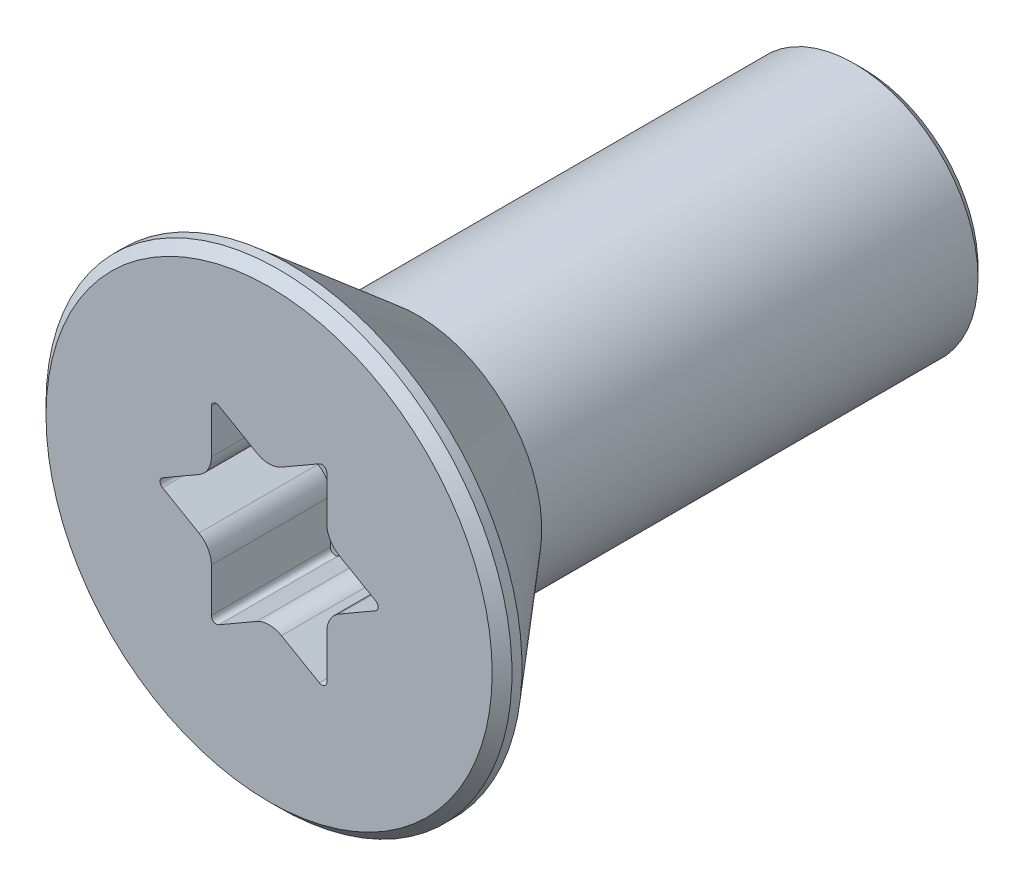
ISO-10303-21;
HEADER;
FILE_DESCRIPTION(('STEP AP214'),'2;1');
FILE_NAME('part.step','',(''),(''),'','','');
FILE_SCHEMA(('AUTOMOTIVE_DESIGN { 1 0 10303 214 1 1 1 1 }'));
ENDSEC;
DATA;
#1=APPLICATION_CONTEXT('core data for automotive mechanical design processes');
#2=APPLICATION_PROTOCOL_DEFINITION('international standard','automotive_design',2000,#1);
#3=PRODUCT_CONTEXT('',#1,'mechanical');
#4=PRODUCT('Part','Part','',(#3));
#5=PRODUCT_RELATED_PRODUCT_CATEGORY('part','',(#4));
#6=PRODUCT_DEFINITION_FORMATION('','',#4);
#7=PRODUCT_DEFINITION_CONTEXT('part definition',#1,'design');
#8=PRODUCT_DEFINITION('design','',#6,#7);
#9=PRODUCT_DEFINITION_SHAPE('','',#8);
#10=(LENGTH_UNIT() NAMED_UNIT(*) SI_UNIT(.MILLI.,.METRE.));
#11=(NAMED_UNIT(*) PLANE_ANGLE_UNIT() SI_UNIT($,.RADIAN.));
#12=(NAMED_UNIT(*) SI_UNIT($,.STERADIAN.) SOLID_ANGLE_UNIT());
#13=UNCERTAINTY_MEASURE_WITH_UNIT(LENGTH_MEASURE(1.E-05),#10,'distance_accuracy_value','');
#14=(GEOMETRIC_REPRESENTATION_CONTEXT(3) GLOBAL_UNCERTAINTY_ASSIGNED_CONTEXT((#13)) GLOBAL_UNIT_ASSIGNED_CONTEXT((#10,
#11,#12)) REPRESENTATION_CONTEXT('',''));
#15=CARTESIAN_POINT('',(0.,0.,0.));
#16=DIRECTION('',(0.,0.,1.));
#17=DIRECTION('',(1.,0.,0.));
#18=AXIS2_PLACEMENT_3D('',#15,#16,#17);
#19=CARTESIAN_POINT('',(95.7999999999978,-74.700000000006,105.35000000001));
#20=DIRECTION('',(0.,0.,1.));
#21=DIRECTION('',(1.,0.,0.));
#22=AXIS2_PLACEMENT_3D('',#19,#20,#21);
#23=PLANE('',#22);
#24=CARTESIAN_POINT('',(95.7999999999978,-75.6526279441494,105.35000000001));
#25=DIRECTION('',(0.,0.,1.));
#26=DIRECTION('',(1.,0.,0.));
#27=AXIS2_PLACEMENT_3D('',#24,#25,#26);
#28=CIRCLE('',#27,0.249999999999991);
#29=CARTESIAN_POINT('',(95.9250000000039,-75.4361215932114,105.35000000001));
#30=VERTEX_POINT('',#29);
#31=CARTESIAN_POINT('',(95.6750000000031,-75.4361215932093,105.35000000001));
#32=VERTEX_POINT('',#31);
#33=EDGE_CURVE('E345',#30,#32,#28,.T.);
#34=ORIENTED_EDGE('',*,*,#33,.F.);
#35=DIRECTION('',(-0.866025403780578,0.500000000006687,0.));
#36=VECTOR('',#35,1.);
#37=CARTESIAN_POINT('',(96.1160254037852,-75.546410161513,105.35000000001));
#38=LINE('',#37,#36);
#39=CARTESIAN_POINT('',(96.3070508075659,-75.6566987298098,105.35000000001));
#40=VERTEX_POINT('',#39);
#41=EDGE_CURVE('E252',#40,#30,#38,.T.);
#42=ORIENTED_EDGE('',*,*,#41,.F.);
#43=CARTESIAN_POINT('',(96.332050807573,-75.6133974596184,105.35000000001));
#44=DIRECTION('',(0.,0.,1.));
#45=DIRECTION('',(1.,0.,0.));
#46=AXIS2_PLACEMENT_3D('',#43,#44,#45);
#47=CIRCLE('',#46,0.0500000000000032);
#48=CARTESIAN_POINT('',(96.3820508075729,-75.6133974596184,105.35000000001));
#49=VERTEX_POINT('',#48);
#50=EDGE_CURVE('E347',#40,#49,#47,.T.);
#51=ORIENTED_EDGE('',*,*,#50,.T.);
#52=DIRECTION('',(0.,1.,0.));
#53=VECTOR('',#52,1.);
#54=CARTESIAN_POINT('',(96.3820508075728,-75.392820323024,105.35000000001));
#55=LINE('',#54,#53);
#56=CARTESIAN_POINT('',(96.3820508075728,-75.1722431864296,105.35000000001));
#57=VERTEX_POINT('',#56);
#58=EDGE_CURVE('E257',#49,#57,#55,.T.);
#59=ORIENTED_EDGE('',*,*,#58,.T.);
#60=CARTESIAN_POINT('',(96.6320508075718,-75.1722431864296,105.35000000001));
#61=DIRECTION('',(0.,0.,1.));
#62=DIRECTION('',(1.,0.,0.));
#63=AXIS2_PLACEMENT_3D('',#60,#61,#62);
#64=CIRCLE('',#63,0.249999999999991);
#65=CARTESIAN_POINT('',(96.5070508075622,-74.9557368354843,105.35000000001));
#66=VERTEX_POINT('',#65);
#67=EDGE_CURVE('E199',#66,#57,#64,.T.);
#68=ORIENTED_EDGE('',*,*,#67,.F.);
#69=DIRECTION('',(-0.866025403783245,-0.500000000002068,0.));
#70=VECTOR('',#69,1.);
#71=CARTESIAN_POINT('',(96.6910254037702,-74.8495190528342,105.35000000001));
#72=LINE('',#71,#70);
#73=CARTESIAN_POINT('',(96.8749999999912,-74.7433012701814,105.35000000001));
#74=VERTEX_POINT('',#73);
#75=EDGE_CURVE('E197',#74,#66,#72,.T.);
#76=ORIENTED_EDGE('',*,*,#75,.F.);
#77=CARTESIAN_POINT('',(96.8499999999936,-74.700000000006,105.35000000001));
#78=DIRECTION('',(0.,0.,1.));
#79=DIRECTION('',(1.,0.,0.));
#80=AXIS2_PLACEMENT_3D('',#77,#78,#79);
#81=CIRCLE('',#80,0.0500000000000032);
#82=CARTESIAN_POINT('',(96.8750000000022,-74.6566987298116,105.35000000001));
#83=VERTEX_POINT('',#82);
#84=EDGE_CURVE('E20',#74,#83,#81,.T.);
#85=ORIENTED_EDGE('',*,*,#84,.T.);
#86=DIRECTION('',(-0.86602540378322,0.500000000002111,0.));
#87=VECTOR('',#86,1.);
#88=CARTESIAN_POINT('',(96.6910254037702,-74.5504809471524,105.35000000001));
#89=LINE('',#88,#87);
#90=CARTESIAN_POINT('',(96.5070508075711,-74.4442631645122,105.35000000001));
#91=VERTEX_POINT('',#90);
#92=EDGE_CURVE('E212',#83,#91,#89,.T.);
#93=ORIENTED_EDGE('',*,*,#92,.T.);
#94=CARTESIAN_POINT('',(96.6320508075718,-74.2277568135824,105.35000000001));
#95=DIRECTION('',(0.,0.,1.));
#96=DIRECTION('',(1.,0.,0.));
#97=AXIS2_PLACEMENT_3D('',#94,#95,#96);
#98=CIRCLE('',#97,0.249999999999991);
#99=CARTESIAN_POINT('',(96.3820508075723,-74.2277568135824,105.35000000001));
#100=VERTEX_POINT('',#99);
#101=EDGE_CURVE('E327',#100,#91,#98,.T.);
#102=ORIENTED_EDGE('',*,*,#101,.F.);
#103=DIRECTION('',(0.,1.,0.));
#104=VECTOR('',#103,1.);
#105=CARTESIAN_POINT('',(96.3820508075728,-74.0071796769626,105.35000000001));
#106=LINE('',#105,#104);
#107=CARTESIAN_POINT('',(96.3820508075728,-73.7866025403682,105.35000000001));
#108=VERTEX_POINT('',#107);
#109=EDGE_CURVE('E215',#100,#108,#106,.T.);
#110=ORIENTED_EDGE('',*,*,#109,.T.);
#111=CARTESIAN_POINT('',(96.332050807573,-73.7866025403682,105.35000000001));
#112=DIRECTION('',(0.,0.,1.));
#113=DIRECTION('',(1.,0.,0.));
#114=AXIS2_PLACEMENT_3D('',#111,#112,#113);
#115=CIRCLE('',#114,0.0500000000000032);
#116=CARTESIAN_POINT('',(96.3070508075618,-73.7433012701823,105.35000000001));
#117=VERTEX_POINT('',#116);
#118=EDGE_CURVE('E331',#108,#117,#115,.T.);
#119=ORIENTED_EDGE('',*,*,#118,.T.);
#120=DIRECTION('',(-0.866025403780578,-0.500000000006687,0.));
#121=VECTOR('',#120,1.);
#122=CARTESIAN_POINT('',(96.1160254037852,-73.8535898384736,105.35000000001));
#123=LINE('',#122,#121);
#124=CARTESIAN_POINT('',(95.9249999999965,-73.963878406775,105.35000000001));
#125=VERTEX_POINT('',#124);
#126=EDGE_CURVE('E220',#117,#125,#123,.T.);
#127=ORIENTED_EDGE('',*,*,#126,.T.);
#128=CARTESIAN_POINT('',(95.7999999999978,-73.7473720558372,105.35000000001));
#129=DIRECTION('',(0.,0.,1.));
#130=DIRECTION('',(1.,0.,0.));
#131=AXIS2_PLACEMENT_3D('',#128,#129,#130);
#132=CIRCLE('',#131,0.249999999999991);
#133=CARTESIAN_POINT('',(95.6750000000067,-73.9638784067839,105.35000000001));
#134=VERTEX_POINT('',#133);
#135=EDGE_CURVE('E223',#134,#125,#132,.T.);
#136=ORIENTED_EDGE('',*,*,#135,.F.);
#137=DIRECTION('',(-0.866025403780578,0.500000000006687,0.));
#138=VECTOR('',#137,1.);
#139=CARTESIAN_POINT('',(95.4839745962104,-73.8535898384736,105.35000000001));
#140=LINE('',#139,#138);
#141=CARTESIAN_POINT('',(95.2929491924352,-73.7433012701799,105.35000000001));
#142=VERTEX_POINT('',#141);
#143=EDGE_CURVE('E224',#134,#142,#140,.T.);
#144=ORIENTED_EDGE('',*,*,#143,.T.);
#145=CARTESIAN_POINT('',(95.2679491924226,-73.7866025403682,105.35000000001));
#146=DIRECTION('',(0.,0.,1.));
#147=DIRECTION('',(1.,0.,0.));
#148=AXIS2_PLACEMENT_3D('',#145,#146,#147);
#149=CIRCLE('',#148,0.0500000000000032);
#150=CARTESIAN_POINT('',(95.2179491924227,-73.7866025403682,105.35000000001));
#151=VERTEX_POINT('',#150);
#152=EDGE_CURVE('E232',#142,#151,#149,.T.);
#153=ORIENTED_EDGE('',*,*,#152,.T.);
#154=DIRECTION('',(0.,1.,0.));
#155=VECTOR('',#154,1.);
#156=CARTESIAN_POINT('',(95.2179491924228,-74.0071796769626,105.35000000001));
#157=LINE('',#156,#155);
#158=CARTESIAN_POINT('',(95.2179491924228,-74.2277568135824,105.35000000001));
#159=VERTEX_POINT('',#158);
#160=EDGE_CURVE('E229',#159,#151,#157,.T.);
#161=ORIENTED_EDGE('',*,*,#160,.F.);
#162=CARTESIAN_POINT('',(94.9679491924238,-74.2277568135824,105.35000000001));
#163=DIRECTION('',(0.,0.,1.));
#164=DIRECTION('',(1.,0.,0.));
#165=AXIS2_PLACEMENT_3D('',#162,#163,#164);
#166=CIRCLE('',#165,0.249999999999991);
#167=CARTESIAN_POINT('',(95.0929491924279,-74.4442631645182,105.35000000001));
#168=VERTEX_POINT('',#167);
#169=EDGE_CURVE('E337',#168,#159,#166,.T.);
#170=ORIENTED_EDGE('',*,*,#169,.F.);
#171=DIRECTION('',(-0.86602540378322,-0.500000000002111,0.));
#172=VECTOR('',#171,1.);
#173=CARTESIAN_POINT('',(94.9089745962254,-74.5504809471524,105.35000000001));
#174=LINE('',#173,#172);
#175=CARTESIAN_POINT('',(94.7249999999934,-74.6566987298116,105.35000000001));
#176=VERTEX_POINT('',#175);
#177=EDGE_CURVE('E234',#168,#176,#174,.T.);
#178=ORIENTED_EDGE('',*,*,#177,.T.);
#179=CARTESIAN_POINT('',(94.750000000002,-74.700000000006,105.35000000001));
#180=DIRECTION('',(0.,0.,1.));
#181=DIRECTION('',(1.,0.,0.));
#182=AXIS2_PLACEMENT_3D('',#179,#180,#181);
#183=CIRCLE('',#182,0.0500000000000032);
#184=CARTESIAN_POINT('',(94.7250000000011,-74.7433012701871,105.35000000001));
#185=VERTEX_POINT('',#184);
#186=EDGE_CURVE('E241',#176,#185,#183,.T.);
#187=ORIENTED_EDGE('',*,*,#186,.T.);
#188=DIRECTION('',(-0.866025403783288,0.500000000001993,0.));
#189=VECTOR('',#188,1.);
#190=CARTESIAN_POINT('',(94.9089745962254,-74.8495190528342,105.35000000001));
#191=LINE('',#190,#189);
#192=CARTESIAN_POINT('',(95.0929491924355,-74.9557368354807,105.35000000001));
#193=VERTEX_POINT('',#192);
#194=EDGE_CURVE('E238',#193,#185,#191,.T.);
#195=ORIENTED_EDGE('',*,*,#194,.F.);
#196=CARTESIAN_POINT('',(94.9679491924238,-75.1722431864296,105.35000000001));
#197=DIRECTION('',(0.,0.,1.));
#198=DIRECTION('',(1.,0.,0.));
#199=AXIS2_PLACEMENT_3D('',#196,#197,#198);
#200=CIRCLE('',#199,0.249999999999991);
#201=CARTESIAN_POINT('',(95.2179491924233,-75.1722431864296,105.35000000001));
#202=VERTEX_POINT('',#201);
#203=EDGE_CURVE('E341',#202,#193,#200,.T.);
#204=ORIENTED_EDGE('',*,*,#203,.F.);
#205=DIRECTION('',(0.,1.,0.));
#206=VECTOR('',#205,1.);
#207=CARTESIAN_POINT('',(95.2179491924228,-75.392820323024,105.35000000001));
#208=LINE('',#207,#206);
#209=CARTESIAN_POINT('',(95.2179491924228,-75.6133974596184,105.35000000001));
#210=VERTEX_POINT('',#209);
#211=EDGE_CURVE('E243',#210,#202,#208,.T.);
#212=ORIENTED_EDGE('',*,*,#211,.F.);
#213=CARTESIAN_POINT('',(95.2679491924226,-75.6133974596184,105.35000000001));
#214=DIRECTION('',(0.,0.,1.));
#215=DIRECTION('',(1.,0.,0.));
#216=AXIS2_PLACEMENT_3D('',#213,#214,#215);
#217=CIRCLE('',#216,0.0500000000000032);
#218=CARTESIAN_POINT('',(95.2929491924283,-75.6566987298075,105.35000000001));
#219=VERTEX_POINT('',#218);
#220=EDGE_CURVE('E250',#210,#219,#217,.T.);
#221=ORIENTED_EDGE('',*,*,#220,.T.);
#222=DIRECTION('',(-0.866025403780578,-0.500000000006687,0.));
#223=VECTOR('',#222,1.);
#224=CARTESIAN_POINT('',(95.4839745962104,-75.546410161513,105.35000000001));
#225=LINE('',#224,#223);
#226=EDGE_CURVE('E247',#32,#219,#225,.T.);
#227=ORIENTED_EDGE('',*,*,#226,.F.);
#228=EDGE_LOOP('',(#34,#42,#51,#59,#68,#76,#85,#93,#102,#110,#119,#127,#136,#144,#153,#161,#170,
#178,#187,#195,#204,#212,#221,#227));
#229=FACE_BOUND('',#228,.T.);
#230=ADVANCED_FACE('F17',(#229),#23,.T.);
#231=CARTESIAN_POINT('',(96.8499999999936,-74.700000000006,105.326000000004));
#232=DIRECTION('',(0.,0.,1.));
#233=DIRECTION('',(1.,0.,0.));
#234=AXIS2_PLACEMENT_3D('',#231,#232,#233);
#235=CYLINDRICAL_SURFACE('',#234,0.0500000000000032);
#236=ORIENTED_EDGE('',*,*,#84,.F.);
#237=DIRECTION('',(0.,0.,1.));
#238=VECTOR('',#237,1.);
#239=CARTESIAN_POINT('',(96.8749999999953,-74.743301270179,105.950000000008));
#240=LINE('',#239,#238);
#241=CARTESIAN_POINT('',(96.8749999999962,-74.743301270191,106.550000000006));
#242=VERTEX_POINT('',#241);
#243=EDGE_CURVE('E190',#242,#74,#240,.F.);
#244=ORIENTED_EDGE('',*,*,#243,.F.);
#245=CARTESIAN_POINT('',(96.8499999999936,-74.700000000006,106.550000000006));
#246=DIRECTION('',(0.,0.,1.));
#247=DIRECTION('',(1.,0.,0.));
#248=AXIS2_PLACEMENT_3D('',#245,#246,#247);
#249=CIRCLE('',#248,0.0500000000000032);
#250=CARTESIAN_POINT('',(96.8750000000017,-74.6566987298115,106.550000000006));
#251=VERTEX_POINT('',#250);
#252=EDGE_CURVE('E325',#251,#242,#249,.F.);
#253=ORIENTED_EDGE('',*,*,#252,.F.);
#254=DIRECTION('',(0.,0.,1.));
#255=VECTOR('',#254,1.);
#256=CARTESIAN_POINT('',(96.8750000000063,-74.656698729814,105.950000000008));
#257=LINE('',#256,#255);
#258=EDGE_CURVE('E193',#251,#83,#257,.F.);
#259=ORIENTED_EDGE('',*,*,#258,.T.);
#260=EDGE_LOOP('',(#236,#244,#253,#259));
#261=FACE_BOUND('',#260,.T.);
#262=ADVANCED_FACE('F188',(#261),#235,.F.);
#263=CARTESIAN_POINT('',(96.6910254037702,-74.8495190528342,105.950000000008));
#264=DIRECTION('',(-0.500000000002068,0.866025403783245,0.));
#265=DIRECTION('',(-0.866025403783245,-0.500000000002068,0.));
#266=AXIS2_PLACEMENT_3D('',#263,#264,#265);
#267=PLANE('',#266);
#268=DIRECTION('',(0.,0.,1.));
#269=VECTOR('',#268,1.);
#270=CARTESIAN_POINT('',(96.5070508075572,-74.9557368354919,105.326000000004));
#271=LINE('',#270,#269);
#272=CARTESIAN_POINT('',(96.5070508075677,-74.9557368354886,106.550000000006));
#273=VERTEX_POINT('',#272);
#274=EDGE_CURVE('E202',#273,#66,#271,.F.);
#275=ORIENTED_EDGE('',*,*,#274,.F.);
#276=DIRECTION('',(-0.866025403793562,-0.499999999984198,0.));
#277=VECTOR('',#276,1.);
#278=CARTESIAN_POINT('',(96.8750000000062,-74.7433012701978,106.550000000006));
#279=LINE('',#278,#277);
#280=EDGE_CURVE('E206',#242,#273,#279,.T.);
#281=ORIENTED_EDGE('',*,*,#280,.F.);
#282=ORIENTED_EDGE('',*,*,#243,.T.);
#283=ORIENTED_EDGE('',*,*,#75,.T.);
#284=EDGE_LOOP('',(#275,#281,#282,#283));
#285=FACE_BOUND('',#284,.T.);
#286=ADVANCED_FACE('F204',(#285),#267,.T.);
#287=CARTESIAN_POINT('',(96.6320508075718,-75.1722431864296,105.326000000004));
#288=DIRECTION('',(0.,0.,1.));
#289=DIRECTION('',(1.,0.,0.));
#290=AXIS2_PLACEMENT_3D('',#287,#288,#289);
#291=CYLINDRICAL_SURFACE('',#290,0.249999999999991);
#292=DIRECTION('',(0.,0.,-1.));
#293=VECTOR('',#292,1.);
#294=CARTESIAN_POINT('',(96.3820508075728,-75.1722431864296,105.950000000008));
#295=LINE('',#294,#293);
#296=CARTESIAN_POINT('',(96.3820508075728,-75.1722431864296,106.550000000006));
#297=VERTEX_POINT('',#296);
#298=EDGE_CURVE('E258',#57,#297,#295,.F.);
#299=ORIENTED_EDGE('',*,*,#298,.T.);
#300=CARTESIAN_POINT('',(96.6320508075718,-75.1722431864296,106.550000000006));
#301=DIRECTION('',(0.,0.,1.));
#302=DIRECTION('',(1.,0.,0.));
#303=AXIS2_PLACEMENT_3D('',#300,#301,#302);
#304=CIRCLE('',#303,0.249999999999991);
#305=EDGE_CURVE('E322',#273,#297,#304,.T.);
#306=ORIENTED_EDGE('',*,*,#305,.F.);
#307=ORIENTED_EDGE('',*,*,#274,.T.);
#308=ORIENTED_EDGE('',*,*,#67,.T.);
#309=EDGE_LOOP('',(#299,#306,#307,#308));
#310=FACE_BOUND('',#309,.T.);
#311=ADVANCED_FACE('F352',(#310),#291,.T.);
#312=CARTESIAN_POINT('',(96.3820508075728,-75.392820323024,105.950000000008));
#313=DIRECTION('',(1.,0.,0.));
#314=DIRECTION('',(0.,0.,-1.));
#315=AXIS2_PLACEMENT_3D('',#312,#313,#314);
#316=PLANE('',#315);
#317=ORIENTED_EDGE('',*,*,#58,.F.);
#318=DIRECTION('',(0.,0.,1.));
#319=VECTOR('',#318,1.);
#320=CARTESIAN_POINT('',(96.382050807573,-75.6133974596184,105.326000000004));
#321=LINE('',#320,#319);
#322=CARTESIAN_POINT('',(96.3820508075729,-75.6133974596184,106.550000000006));
#323=VERTEX_POINT('',#322);
#324=EDGE_CURVE('E348',#49,#323,#321,.T.);
#325=ORIENTED_EDGE('',*,*,#324,.T.);
#326=DIRECTION('',(0.,1.,0.));
#327=VECTOR('',#326,1.);
#328=CARTESIAN_POINT('',(96.3820508075728,-74.700000000006,106.550000000006));
#329=LINE('',#328,#327);
#330=EDGE_CURVE('E321',#297,#323,#329,.F.);
#331=ORIENTED_EDGE('',*,*,#330,.F.);
#332=ORIENTED_EDGE('',*,*,#298,.F.);
#333=EDGE_LOOP('',(#317,#325,#331,#332));
#334=FACE_BOUND('',#333,.T.);
#335=ADVANCED_FACE('F400',(#334),#316,.F.);
#336=CARTESIAN_POINT('',(96.332050807573,-75.6133974596184,105.326000000004));
#337=DIRECTION('',(0.,0.,1.));
#338=DIRECTION('',(1.,0.,0.));
#339=AXIS2_PLACEMENT_3D('',#336,#337,#338);
#340=CYLINDRICAL_SURFACE('',#339,0.0500000000000032);
#341=ORIENTED_EDGE('',*,*,#50,.F.);
#342=DIRECTION('',(0.,0.,1.));
#343=VECTOR('',#342,1.);
#344=CARTESIAN_POINT('',(96.3070508075619,-75.6566987298075,105.950000000008));
#345=LINE('',#344,#343);
#346=CARTESIAN_POINT('',(96.3070508075649,-75.656698729811,106.550000000006));
#347=VERTEX_POINT('',#346);
#348=EDGE_CURVE('E256',#347,#40,#345,.F.);
#349=ORIENTED_EDGE('',*,*,#348,.F.);
#350=CARTESIAN_POINT('',(96.332050807573,-75.6133974596184,106.550000000006));
#351=DIRECTION('',(0.,0.,1.));
#352=DIRECTION('',(1.,0.,0.));
#353=AXIS2_PLACEMENT_3D('',#350,#351,#352);
#354=CIRCLE('',#353,0.0500000000000032);
#355=EDGE_CURVE('E318',#323,#347,#354,.F.);
#356=ORIENTED_EDGE('',*,*,#355,.F.);
#357=ORIENTED_EDGE('',*,*,#324,.F.);
#358=EDGE_LOOP('',(#341,#349,#356,#357));
#359=FACE_BOUND('',#358,.T.);
#360=ADVANCED_FACE('F404',(#359),#340,.F.);
#361=CARTESIAN_POINT('',(96.1160254037852,-75.546410161513,105.950000000008));
#362=DIRECTION('',(0.500000000006687,0.866025403780578,0.));
#363=DIRECTION('',(-0.866025403780578,0.500000000006687,0.));
#364=AXIS2_PLACEMENT_3D('',#361,#362,#363);
#365=PLANE('',#364);
#366=DIRECTION('',(0.,0.,1.));
#367=VECTOR('',#366,1.);
#368=CARTESIAN_POINT('',(95.9250000000123,-75.4361215932117,105.326000000004));
#369=LINE('',#368,#367);
#370=CARTESIAN_POINT('',(95.9250000000062,-75.4361215932109,106.550000000006));
#371=VERTEX_POINT('',#370);
#372=EDGE_CURVE('E255',#371,#30,#369,.F.);
#373=ORIENTED_EDGE('',*,*,#372,.F.);
#374=DIRECTION('',(-0.866025403773598,0.500000000018777,0.));
#375=VECTOR('',#374,1.);
#376=CARTESIAN_POINT('',(96.3070508075604,-75.6566987298102,106.550000000006));
#377=LINE('',#376,#375);
#378=EDGE_CURVE('E317',#347,#371,#377,.T.);
#379=ORIENTED_EDGE('',*,*,#378,.F.);
#380=ORIENTED_EDGE('',*,*,#348,.T.);
#381=ORIENTED_EDGE('',*,*,#41,.T.);
#382=EDGE_LOOP('',(#373,#379,#380,#381));
#383=FACE_BOUND('',#382,.T.);
#384=ADVANCED_FACE('F408',(#383),#365,.T.);
#385=CARTESIAN_POINT('',(95.7999999999978,-75.6526279441494,105.326000000004));
#386=DIRECTION('',(0.,0.,1.));
#387=DIRECTION('',(1.,0.,0.));
#388=AXIS2_PLACEMENT_3D('',#385,#386,#387);
#389=CYLINDRICAL_SURFACE('',#388,0.249999999999991);
#390=CARTESIAN_POINT('',(95.7999999999978,-75.6526279441494,106.550000000006));
#391=DIRECTION('',(0.,0.,1.));
#392=DIRECTION('',(1.,0.,0.));
#393=AXIS2_PLACEMENT_3D('',#390,#391,#392);
#394=CIRCLE('',#393,0.249999999999991);
#395=CARTESIAN_POINT('',(95.6750000000071,-75.4361215932125,106.550000000006));
#396=VERTEX_POINT('',#395);
#397=EDGE_CURVE('E314',#371,#396,#394,.T.);
#398=ORIENTED_EDGE('',*,*,#397,.F.);
#399=ORIENTED_EDGE('',*,*,#372,.T.);
#400=ORIENTED_EDGE('',*,*,#33,.T.);
#401=DIRECTION('',(0.,0.,1.));
#402=VECTOR('',#401,1.);
#403=CARTESIAN_POINT('',(95.6750000000062,-75.4361215932075,105.950000000008));
#404=LINE('',#403,#402);
#405=EDGE_CURVE('E251',#396,#32,#404,.F.);
#406=ORIENTED_EDGE('',*,*,#405,.F.);
#407=EDGE_LOOP('',(#398,#399,#400,#406));
#408=FACE_BOUND('',#407,.T.);
#409=ADVANCED_FACE('F702',(#408),#389,.T.);
#410=CARTESIAN_POINT('',(95.4839745962104,-75.546410161513,105.950000000008));
#411=DIRECTION('',(-0.500000000006687,0.866025403780578,0.));
#412=DIRECTION('',(-0.866025403780578,-0.500000000006687,0.));
#413=AXIS2_PLACEMENT_3D('',#410,#411,#412);
#414=PLANE('',#413);
#415=DIRECTION('',(0.,0.,1.));
#416=VECTOR('',#415,1.);
#417=CARTESIAN_POINT('',(95.2929491924309,-75.6566987298028,105.326000000004));
#418=LINE('',#417,#416);
#419=CARTESIAN_POINT('',(95.2929491924287,-75.656698729809,106.550000000006));
#420=VERTEX_POINT('',#419);
#421=EDGE_CURVE('E344',#219,#420,#418,.T.);
#422=ORIENTED_EDGE('',*,*,#421,.T.);
#423=DIRECTION('',(-0.86602540378799,-0.49999999999385,0.));
#424=VECTOR('',#423,1.);
#425=CARTESIAN_POINT('',(95.675000000011,-75.4361215932158,106.550000000006));
#426=LINE('',#425,#424);
#427=EDGE_CURVE('E313',#396,#420,#426,.T.);
#428=ORIENTED_EDGE('',*,*,#427,.F.);
#429=ORIENTED_EDGE('',*,*,#405,.T.);
#430=ORIENTED_EDGE('',*,*,#226,.T.);
#431=EDGE_LOOP('',(#422,#428,#429,#430));
#432=FACE_BOUND('',#431,.T.);
#433=ADVANCED_FACE('F692',(#432),#414,.T.);
#434=CARTESIAN_POINT('',(95.2679491924226,-75.6133974596184,105.326000000004));
#435=DIRECTION('',(0.,0.,1.));
#436=DIRECTION('',(1.,0.,0.));
#437=AXIS2_PLACEMENT_3D('',#434,#435,#436);
#438=CYLINDRICAL_SURFACE('',#437,0.0500000000000032);
#439=ORIENTED_EDGE('',*,*,#220,.F.);
#440=DIRECTION('',(0.,0.,-1.));
#441=VECTOR('',#440,1.);
#442=CARTESIAN_POINT('',(95.2179491924228,-75.6133974596184,105.950000000008));
#443=LINE('',#442,#441);
#444=CARTESIAN_POINT('',(95.2179491924228,-75.6133974596184,106.550000000006));
#445=VERTEX_POINT('',#444);
#446=EDGE_CURVE('E246',#445,#210,#443,.T.);
#447=ORIENTED_EDGE('',*,*,#446,.F.);
#448=CARTESIAN_POINT('',(95.2679491924226,-75.6133974596184,106.550000000006));
#449=DIRECTION('',(0.,0.,1.));
#450=DIRECTION('',(1.,0.,0.));
#451=AXIS2_PLACEMENT_3D('',#448,#449,#450);
#452=CIRCLE('',#451,0.0500000000000032);
#453=EDGE_CURVE('E310',#420,#445,#452,.F.);
#454=ORIENTED_EDGE('',*,*,#453,.F.);
#455=ORIENTED_EDGE('',*,*,#421,.F.);
#456=EDGE_LOOP('',(#439,#447,#454,#455));
#457=FACE_BOUND('',#456,.T.);
#458=ADVANCED_FACE('F682',(#457),#438,.F.);
#459=CARTESIAN_POINT('',(95.2179491924228,-75.392820323024,105.950000000008));
#460=DIRECTION('',(1.,0.,0.));
#461=DIRECTION('',(0.,0.,-1.));
#462=AXIS2_PLACEMENT_3D('',#459,#460,#461);
#463=PLANE('',#462);
#464=DIRECTION('',(0.,0.,1.));
#465=VECTOR('',#464,1.);
#466=CARTESIAN_POINT('',(95.2179491924238,-75.1722431864296,105.326000000004));
#467=LINE('',#466,#465);
#468=CARTESIAN_POINT('',(95.2179491924233,-75.1722431864296,106.550000000006));
#469=VERTEX_POINT('',#468);
#470=EDGE_CURVE('E245',#469,#202,#467,.F.);
#471=ORIENTED_EDGE('',*,*,#470,.F.);
#472=DIRECTION('',(0.,1.,0.));
#473=VECTOR('',#472,1.);
#474=CARTESIAN_POINT('',(95.2179491924228,-74.700000000006,106.550000000006));
#475=LINE('',#474,#473);
#476=EDGE_CURVE('E309',#445,#469,#475,.T.);
#477=ORIENTED_EDGE('',*,*,#476,.F.);
#478=ORIENTED_EDGE('',*,*,#446,.T.);
#479=ORIENTED_EDGE('',*,*,#211,.T.);
#480=EDGE_LOOP('',(#471,#477,#478,#479));
#481=FACE_BOUND('',#480,.T.);
#482=ADVANCED_FACE('F672',(#481),#463,.T.);
#483=CARTESIAN_POINT('',(94.9679491924238,-75.1722431864296,105.326000000004));
#484=DIRECTION('',(0.,0.,1.));
#485=DIRECTION('',(1.,0.,0.));
#486=AXIS2_PLACEMENT_3D('',#483,#484,#485);
#487=CYLINDRICAL_SURFACE('',#486,0.249999999999991);
#488=DIRECTION('',(0.,0.,1.));
#489=VECTOR('',#488,1.);
#490=CARTESIAN_POINT('',(95.0929491924425,-74.9557368354848,105.950000000008));
#491=LINE('',#490,#489);
#492=CARTESIAN_POINT('',(95.09294919243,-74.955736835485,106.550000000006));
#493=VERTEX_POINT('',#492);
#494=EDGE_CURVE('E242',#493,#193,#491,.F.);
#495=ORIENTED_EDGE('',*,*,#494,.F.);
#496=CARTESIAN_POINT('',(94.9679491924238,-75.1722431864296,106.550000000006));
#497=DIRECTION('',(0.,0.,1.));
#498=DIRECTION('',(1.,0.,0.));
#499=AXIS2_PLACEMENT_3D('',#496,#497,#498);
#500=CIRCLE('',#499,0.249999999999991);
#501=EDGE_CURVE('E306',#469,#493,#500,.T.);
#502=ORIENTED_EDGE('',*,*,#501,.F.);
#503=ORIENTED_EDGE('',*,*,#470,.T.);
#504=ORIENTED_EDGE('',*,*,#203,.T.);
#505=EDGE_LOOP('',(#495,#502,#503,#504));
#506=FACE_BOUND('',#505,.T.);
#507=ADVANCED_FACE('F662',(#506),#487,.T.);
#508=CARTESIAN_POINT('',(94.9089745962254,-74.8495190528342,105.950000000008));
#509=DIRECTION('',(0.500000000001993,0.866025403783288,0.));
#510=DIRECTION('',(-0.866025403783288,0.500000000001993,0.));
#511=AXIS2_PLACEMENT_3D('',#508,#509,#510);
#512=PLANE('',#511);
#513=DIRECTION('',(0.,0.,1.));
#514=VECTOR('',#513,1.);
#515=CARTESIAN_POINT('',(94.7249999999937,-74.7433012701904,105.326000000004));
#516=LINE('',#515,#514);
#517=CARTESIAN_POINT('',(94.7249999999961,-74.7433012701967,106.550000000006));
#518=VERTEX_POINT('',#517);
#519=EDGE_CURVE('E237',#185,#518,#516,.T.);
#520=ORIENTED_EDGE('',*,*,#519,.T.);
#521=DIRECTION('',(-0.866025403793562,0.499999999984198,0.));
#522=VECTOR('',#521,1.);
#523=CARTESIAN_POINT('',(95.092949192436,-74.955736835496,106.550000000006));
#524=LINE('',#523,#522);
#525=EDGE_CURVE('E305',#493,#518,#524,.T.);
#526=ORIENTED_EDGE('',*,*,#525,.F.);
#527=ORIENTED_EDGE('',*,*,#494,.T.);
#528=ORIENTED_EDGE('',*,*,#194,.T.);
#529=EDGE_LOOP('',(#520,#526,#527,#528));
#530=FACE_BOUND('',#529,.T.);
#531=ADVANCED_FACE('F652',(#530),#512,.T.);
#532=CARTESIAN_POINT('',(94.750000000002,-74.700000000006,105.326000000004));
#533=DIRECTION('',(0.,0.,1.));
#534=DIRECTION('',(1.,0.,0.));
#535=AXIS2_PLACEMENT_3D('',#532,#533,#534);
#536=CYLINDRICAL_SURFACE('',#535,0.0500000000000032);
#537=ORIENTED_EDGE('',*,*,#186,.F.);
#538=DIRECTION('',(0.,0.,1.));
#539=VECTOR('',#538,1.);
#540=CARTESIAN_POINT('',(94.7249999999893,-74.656698729814,105.950000000008));
#541=LINE('',#540,#539);
#542=CARTESIAN_POINT('',(94.7249999999939,-74.6566987298115,106.550000000006));
#543=VERTEX_POINT('',#542);
#544=EDGE_CURVE('E236',#176,#543,#541,.T.);
#545=ORIENTED_EDGE('',*,*,#544,.T.);
#546=CARTESIAN_POINT('',(94.750000000002,-74.700000000006,106.550000000006));
#547=DIRECTION('',(0.,0.,1.));
#548=DIRECTION('',(1.,0.,0.));
#549=AXIS2_PLACEMENT_3D('',#546,#547,#548);
#550=CIRCLE('',#549,0.0500000000000032);
#551=EDGE_CURVE('E302',#518,#543,#550,.F.);
#552=ORIENTED_EDGE('',*,*,#551,.F.);
#553=ORIENTED_EDGE('',*,*,#519,.F.);
#554=EDGE_LOOP('',(#537,#545,#552,#553));
#555=FACE_BOUND('',#554,.T.);
#556=ADVANCED_FACE('F642',(#555),#536,.F.);
#557=CARTESIAN_POINT('',(94.9089745962254,-74.5504809471524,105.950000000008));
#558=DIRECTION('',(-0.500000000002111,0.86602540378322,0.));
#559=DIRECTION('',(-0.86602540378322,-0.500000000002111,0.));
#560=AXIS2_PLACEMENT_3D('',#557,#558,#559);
#561=PLANE('',#560);
#562=ORIENTED_EDGE('',*,*,#177,.F.);
#563=DIRECTION('',(0.,0.,1.));
#564=VECTOR('',#563,1.);
#565=CARTESIAN_POINT('',(95.0929491924384,-74.4442631645201,105.326000000004));
#566=LINE('',#565,#564);
#567=CARTESIAN_POINT('',(95.0929491924279,-74.4442631645234,106.550000000006));
#568=VERTEX_POINT('',#567);
#569=EDGE_CURVE('E339',#568,#168,#566,.F.);
#570=ORIENTED_EDGE('',*,*,#569,.F.);
#571=DIRECTION('',(0.866025403793548,0.499999999984223,0.));
#572=VECTOR('',#571,1.);
#573=CARTESIAN_POINT('',(94.7249999999894,-74.6566987298142,106.550000000006));
#574=LINE('',#573,#572);
#575=EDGE_CURVE('E301',#543,#568,#574,.T.);
#576=ORIENTED_EDGE('',*,*,#575,.F.);
#577=ORIENTED_EDGE('',*,*,#544,.F.);
#578=EDGE_LOOP('',(#562,#570,#576,#577));
#579=FACE_BOUND('',#578,.T.);
#580=ADVANCED_FACE('F632',(#579),#561,.F.);
#581=CARTESIAN_POINT('',(94.9679491924238,-74.2277568135824,105.326000000004));
#582=DIRECTION('',(0.,0.,1.));
#583=DIRECTION('',(1.,0.,0.));
#584=AXIS2_PLACEMENT_3D('',#581,#582,#583);
#585=CYLINDRICAL_SURFACE('',#584,0.249999999999991);
#586=DIRECTION('',(0.,0.,-1.));
#587=VECTOR('',#586,1.);
#588=CARTESIAN_POINT('',(95.2179491924228,-74.2277568135824,105.950000000008));
#589=LINE('',#588,#587);
#590=CARTESIAN_POINT('',(95.2179491924228,-74.2277568135824,106.550000000006));
#591=VERTEX_POINT('',#590);
#592=EDGE_CURVE('E233',#591,#159,#589,.T.);
#593=ORIENTED_EDGE('',*,*,#592,.F.);
#594=CARTESIAN_POINT('',(94.9679491924238,-74.2277568135824,106.550000000006));
#595=DIRECTION('',(0.,0.,1.));
#596=DIRECTION('',(1.,0.,0.));
#597=AXIS2_PLACEMENT_3D('',#594,#595,#596);
#598=CIRCLE('',#597,0.249999999999991);
#599=EDGE_CURVE('E298',#568,#591,#598,.T.);
#600=ORIENTED_EDGE('',*,*,#599,.F.);
#601=ORIENTED_EDGE('',*,*,#569,.T.);
#602=ORIENTED_EDGE('',*,*,#169,.T.);
#603=EDGE_LOOP('',(#593,#600,#601,#602));
#604=FACE_BOUND('',#603,.T.);
#605=ADVANCED_FACE('F622',(#604),#585,.T.);
#606=CARTESIAN_POINT('',(95.2179491924228,-74.0071796769626,105.950000000008));
#607=DIRECTION('',(1.,0.,0.));
#608=DIRECTION('',(0.,0.,-1.));
#609=AXIS2_PLACEMENT_3D('',#606,#607,#608);
#610=PLANE('',#609);
#611=DIRECTION('',(0.,0.,1.));
#612=VECTOR('',#611,1.);
#613=CARTESIAN_POINT('',(95.2179491924226,-73.7866025403682,105.326000000004));
#614=LINE('',#613,#612);
#615=CARTESIAN_POINT('',(95.2179491924227,-73.7866025403682,106.550000000006));
#616=VERTEX_POINT('',#615);
#617=EDGE_CURVE('E228',#151,#616,#614,.T.);
#618=ORIENTED_EDGE('',*,*,#617,.T.);
#619=DIRECTION('',(0.,1.,0.));
#620=VECTOR('',#619,1.);
#621=CARTESIAN_POINT('',(95.2179491924228,-74.700000000006,106.550000000006));
#622=LINE('',#621,#620);
#623=EDGE_CURVE('E297',#591,#616,#622,.T.);
#624=ORIENTED_EDGE('',*,*,#623,.F.);
#625=ORIENTED_EDGE('',*,*,#592,.T.);
#626=ORIENTED_EDGE('',*,*,#160,.T.);
#627=EDGE_LOOP('',(#618,#624,#625,#626));
#628=FACE_BOUND('',#627,.T.);
#629=ADVANCED_FACE('F612',(#628),#610,.T.);
#630=CARTESIAN_POINT('',(95.2679491924226,-73.7866025403682,105.326000000004));
#631=DIRECTION('',(0.,0.,1.));
#632=DIRECTION('',(1.,0.,0.));
#633=AXIS2_PLACEMENT_3D('',#630,#631,#632);
#634=CYLINDRICAL_SURFACE('',#633,0.0500000000000032);
#635=ORIENTED_EDGE('',*,*,#152,.F.);
#636=DIRECTION('',(0.,0.,1.));
#637=VECTOR('',#636,1.);
#638=CARTESIAN_POINT('',(95.2929491924447,-73.7433012701854,105.950000000008));
#639=LINE('',#638,#637);
#640=CARTESIAN_POINT('',(95.2929491924301,-73.7433012701879,106.550000000006));
#641=VERTEX_POINT('',#640);
#642=EDGE_CURVE('E227',#142,#641,#639,.T.);
#643=ORIENTED_EDGE('',*,*,#642,.T.);
#644=CARTESIAN_POINT('',(95.2679491924226,-73.7866025403682,106.550000000006));
#645=DIRECTION('',(0.,0.,1.));
#646=DIRECTION('',(1.,0.,0.));
#647=AXIS2_PLACEMENT_3D('',#644,#645,#646);
#648=CIRCLE('',#647,0.0500000000000032);
#649=EDGE_CURVE('E294',#616,#641,#648,.F.);
#650=ORIENTED_EDGE('',*,*,#649,.F.);
#651=ORIENTED_EDGE('',*,*,#617,.F.);
#652=EDGE_LOOP('',(#635,#643,#650,#651));
#653=FACE_BOUND('',#652,.T.);
#654=ADVANCED_FACE('F602',(#653),#634,.F.);
#655=CARTESIAN_POINT('',(95.4839745962104,-73.8535898384736,105.950000000008));
#656=DIRECTION('',(0.500000000006687,0.866025403780578,0.));
#657=DIRECTION('',(-0.866025403780578,0.500000000006687,0.));
#658=AXIS2_PLACEMENT_3D('',#655,#656,#657);
#659=PLANE('',#658);
#660=ORIENTED_EDGE('',*,*,#143,.F.);
#661=DIRECTION('',(0.,0.,1.));
#662=VECTOR('',#661,1.);
#663=CARTESIAN_POINT('',(95.6750000000133,-73.9638784067922,105.326000000004));
#664=LINE('',#663,#662);
#665=CARTESIAN_POINT('',(95.6750000000052,-73.9638784067902,106.550000000006));
#666=VERTEX_POINT('',#665);
#667=EDGE_CURVE('E335',#666,#134,#664,.F.);
#668=ORIENTED_EDGE('',*,*,#667,.F.);
#669=DIRECTION('',(0.866025403787976,-0.499999999993873,0.));
#670=VECTOR('',#669,1.);
#671=CARTESIAN_POINT('',(95.2929491924352,-73.7433012702018,106.550000000006));
#672=LINE('',#671,#670);
#673=EDGE_CURVE('E293',#641,#666,#672,.T.);
#674=ORIENTED_EDGE('',*,*,#673,.F.);
#675=ORIENTED_EDGE('',*,*,#642,.F.);
#676=EDGE_LOOP('',(#660,#668,#674,#675));
#677=FACE_BOUND('',#676,.T.);
#678=ADVANCED_FACE('F592',(#677),#659,.F.);
#679=CARTESIAN_POINT('',(95.7999999999978,-73.7473720558372,105.326000000004));
#680=DIRECTION('',(0.,0.,1.));
#681=DIRECTION('',(1.,0.,0.));
#682=AXIS2_PLACEMENT_3D('',#679,#680,#681);
#683=CYLINDRICAL_SURFACE('',#682,0.249999999999991);
#684=CARTESIAN_POINT('',(95.7999999999978,-73.7473720558372,106.550000000006));
#685=DIRECTION('',(0.,0.,1.));
#686=DIRECTION('',(1.,0.,0.));
#687=AXIS2_PLACEMENT_3D('',#684,#685,#686);
#688=CIRCLE('',#687,0.249999999999991);
#689=CARTESIAN_POINT('',(95.9249999999934,-73.9638784067786,106.550000000006));
#690=VERTEX_POINT('',#689);
#691=EDGE_CURVE('E290',#666,#690,#688,.T.);
#692=ORIENTED_EDGE('',*,*,#691,.F.);
#693=ORIENTED_EDGE('',*,*,#667,.T.);
#694=ORIENTED_EDGE('',*,*,#135,.T.);
#695=DIRECTION('',(0.,0.,1.));
#696=VECTOR('',#695,1.);
#697=CARTESIAN_POINT('',(95.9249999999974,-73.9638784067745,105.950000000008));
#698=LINE('',#697,#696);
#699=EDGE_CURVE('E222',#125,#690,#698,.T.);
#700=ORIENTED_EDGE('',*,*,#699,.T.);
#701=EDGE_LOOP('',(#692,#693,#694,#700));
#702=FACE_BOUND('',#701,.T.);
#703=ADVANCED_FACE('F582',(#702),#683,.T.);
#704=CARTESIAN_POINT('',(96.1160254037852,-73.8535898384736,105.950000000008));
#705=DIRECTION('',(-0.500000000006687,0.866025403780578,0.));
#706=DIRECTION('',(-0.866025403780578,-0.500000000006687,0.));
#707=AXIS2_PLACEMENT_3D('',#704,#705,#706);
#708=PLANE('',#707);
#709=ORIENTED_EDGE('',*,*,#126,.F.);
#710=DIRECTION('',(0.,0.,1.));
#711=VECTOR('',#710,1.);
#712=CARTESIAN_POINT('',(96.3070508075537,-73.7433012701901,105.326000000004));
#713=LINE('',#712,#711);
#714=CARTESIAN_POINT('',(96.3070508075673,-73.74330127019,106.550000000006));
#715=VERTEX_POINT('',#714);
#716=EDGE_CURVE('E219',#117,#715,#713,.T.);
#717=ORIENTED_EDGE('',*,*,#716,.T.);
#718=DIRECTION('',(0.866025403798525,0.499999999975601,0.));
#719=VECTOR('',#718,1.);
#720=CARTESIAN_POINT('',(95.92500000001,-73.9638784067708,106.550000000006));
#721=LINE('',#720,#719);
#722=EDGE_CURVE('E289',#690,#715,#721,.T.);
#723=ORIENTED_EDGE('',*,*,#722,.F.);
#724=ORIENTED_EDGE('',*,*,#699,.F.);
#725=EDGE_LOOP('',(#709,#717,#723,#724));
#726=FACE_BOUND('',#725,.T.);
#727=ADVANCED_FACE('F572',(#726),#708,.F.);
#728=CARTESIAN_POINT('',(96.332050807573,-73.7866025403682,105.326000000004));
#729=DIRECTION('',(0.,0.,1.));
#730=DIRECTION('',(1.,0.,0.));
#731=AXIS2_PLACEMENT_3D('',#728,#729,#730);
#732=CYLINDRICAL_SURFACE('',#731,0.0500000000000032);
#733=ORIENTED_EDGE('',*,*,#118,.F.);
#734=DIRECTION('',(0.,0.,-1.));
#735=VECTOR('',#734,1.);
#736=CARTESIAN_POINT('',(96.3820508075728,-73.7866025403682,105.950000000008));
#737=LINE('',#736,#735);
#738=CARTESIAN_POINT('',(96.3820508075728,-73.7866025403682,106.550000000006));
#739=VERTEX_POINT('',#738);
#740=EDGE_CURVE('E218',#108,#739,#737,.F.);
#741=ORIENTED_EDGE('',*,*,#740,.T.);
#742=CARTESIAN_POINT('',(96.332050807573,-73.7866025403682,106.550000000006));
#743=DIRECTION('',(0.,0.,1.));
#744=DIRECTION('',(1.,0.,0.));
#745=AXIS2_PLACEMENT_3D('',#742,#743,#744);
#746=CIRCLE('',#745,0.0500000000000032);
#747=EDGE_CURVE('E286',#715,#739,#746,.F.);
#748=ORIENTED_EDGE('',*,*,#747,.F.);
#749=ORIENTED_EDGE('',*,*,#716,.F.);
#750=EDGE_LOOP('',(#733,#741,#748,#749));
#751=FACE_BOUND('',#750,.T.);
#752=ADVANCED_FACE('F562',(#751),#732,.F.);
#753=CARTESIAN_POINT('',(96.3820508075728,-74.0071796769626,105.950000000008));
#754=DIRECTION('',(1.,0.,0.));
#755=DIRECTION('',(0.,0.,-1.));
#756=AXIS2_PLACEMENT_3D('',#753,#754,#755);
#757=PLANE('',#756);
#758=ORIENTED_EDGE('',*,*,#109,.F.);
#759=DIRECTION('',(0.,0.,1.));
#760=VECTOR('',#759,1.);
#761=CARTESIAN_POINT('',(96.3820508075718,-74.2277568135824,105.326000000004));
#762=LINE('',#761,#760);
#763=CARTESIAN_POINT('',(96.3820508075723,-74.2277568135824,106.550000000006));
#764=VERTEX_POINT('',#763);
#765=EDGE_CURVE('E330',#764,#100,#762,.F.);
#766=ORIENTED_EDGE('',*,*,#765,.F.);
#767=DIRECTION('',(0.,1.,0.));
#768=VECTOR('',#767,1.);
#769=CARTESIAN_POINT('',(96.3820508075728,-74.700000000006,106.550000000006));
#770=LINE('',#769,#768);
#771=EDGE_CURVE('E285',#739,#764,#770,.F.);
#772=ORIENTED_EDGE('',*,*,#771,.F.);
#773=ORIENTED_EDGE('',*,*,#740,.F.);
#774=EDGE_LOOP('',(#758,#766,#772,#773));
#775=FACE_BOUND('',#774,.T.);
#776=ADVANCED_FACE('F552',(#775),#757,.F.);
#777=CARTESIAN_POINT('',(96.6320508075718,-74.2277568135824,105.326000000004));
#778=DIRECTION('',(0.,0.,1.));
#779=DIRECTION('',(1.,0.,0.));
#780=AXIS2_PLACEMENT_3D('',#777,#778,#779);
#781=CYLINDRICAL_SURFACE('',#780,0.249999999999991);
#782=DIRECTION('',(0.,0.,1.));
#783=VECTOR('',#782,1.);
#784=CARTESIAN_POINT('',(96.5070508075641,-74.4442631645082,105.950000000008));
#785=LINE('',#784,#783);
#786=CARTESIAN_POINT('',(96.5070508075711,-74.4442631645174,106.550000000006));
#787=VERTEX_POINT('',#786);
#788=EDGE_CURVE('E214',#91,#787,#785,.T.);
#789=ORIENTED_EDGE('',*,*,#788,.T.);
#790=CARTESIAN_POINT('',(96.6320508075718,-74.2277568135824,106.550000000006));
#791=DIRECTION('',(0.,0.,1.));
#792=DIRECTION('',(1.,0.,0.));
#793=AXIS2_PLACEMENT_3D('',#790,#791,#792);
#794=CIRCLE('',#793,0.249999999999991);
#795=EDGE_CURVE('E282',#764,#787,#794,.T.);
#796=ORIENTED_EDGE('',*,*,#795,.F.);
#797=ORIENTED_EDGE('',*,*,#765,.T.);
#798=ORIENTED_EDGE('',*,*,#101,.T.);
#799=EDGE_LOOP('',(#789,#796,#797,#798));
#800=FACE_BOUND('',#799,.T.);
#801=ADVANCED_FACE('F542',(#800),#781,.T.);
#802=CARTESIAN_POINT('',(96.6910254037702,-74.5504809471524,105.950000000008));
#803=DIRECTION('',(0.500000000002111,0.86602540378322,0.));
#804=DIRECTION('',(-0.86602540378322,0.500000000002111,0.));
#805=AXIS2_PLACEMENT_3D('',#802,#803,#804);
#806=PLANE('',#805);
#807=ORIENTED_EDGE('',*,*,#92,.F.);
#808=ORIENTED_EDGE('',*,*,#258,.F.);
#809=DIRECTION('',(0.866025403793548,-0.499999999984223,0.));
#810=VECTOR('',#809,1.);
#811=CARTESIAN_POINT('',(96.5070508075596,-74.444263164516,106.550000000006));
#812=LINE('',#811,#810);
#813=EDGE_CURVE('E281',#787,#251,#812,.T.);
#814=ORIENTED_EDGE('',*,*,#813,.F.);
#815=ORIENTED_EDGE('',*,*,#788,.F.);
#816=EDGE_LOOP('',(#807,#808,#814,#815));
#817=FACE_BOUND('',#816,.T.);
#818=ADVANCED_FACE('F533',(#817),#806,.F.);
#819=CARTESIAN_POINT('',(95.7999999999978,-74.700000000006,106.550000000006));
#820=DIRECTION('',(0.,0.,1.));
#821=DIRECTION('',(1.,0.,0.));
#822=AXIS2_PLACEMENT_3D('',#819,#820,#821);
#823=PLANE('',#822);
#824=ORIENTED_EDGE('',*,*,#795,.T.);
#825=ORIENTED_EDGE('',*,*,#813,.T.);
#826=ORIENTED_EDGE('',*,*,#252,.T.);
#827=ORIENTED_EDGE('',*,*,#280,.T.);
#828=ORIENTED_EDGE('',*,*,#305,.T.);
#829=ORIENTED_EDGE('',*,*,#330,.T.);
#830=ORIENTED_EDGE('',*,*,#355,.T.);
#831=ORIENTED_EDGE('',*,*,#378,.T.);
#832=ORIENTED_EDGE('',*,*,#397,.T.);
#833=ORIENTED_EDGE('',*,*,#427,.T.);
#834=ORIENTED_EDGE('',*,*,#453,.T.);
#835=ORIENTED_EDGE('',*,*,#476,.T.);
#836=ORIENTED_EDGE('',*,*,#501,.T.);
#837=ORIENTED_EDGE('',*,*,#525,.T.);
#838=ORIENTED_EDGE('',*,*,#551,.T.);
#839=ORIENTED_EDGE('',*,*,#575,.T.);
#840=ORIENTED_EDGE('',*,*,#599,.T.);
#841=ORIENTED_EDGE('',*,*,#623,.T.);
#842=ORIENTED_EDGE('',*,*,#649,.T.);
#843=ORIENTED_EDGE('',*,*,#673,.T.);
#844=ORIENTED_EDGE('',*,*,#691,.T.);
#845=ORIENTED_EDGE('',*,*,#722,.T.);
#846=ORIENTED_EDGE('',*,*,#747,.T.);
#847=ORIENTED_EDGE('',*,*,#771,.T.);
#848=EDGE_LOOP('',(#824,#825,#826,#827,#828,#829,#830,#831,#832,#833,#834,#835,#836,#837,#838,
#839,#840,#841,#842,#843,#844,#845,#846,#847));
#849=FACE_BOUND('',#848,.T.);
#850=CARTESIAN_POINT('',(95.7999999999978,-74.700000000006,106.550000000006));
#851=DIRECTION('',(0.,0.,1.));
#852=DIRECTION('',(1.,0.,0.));
#853=AXIS2_PLACEMENT_3D('',#850,#851,#852);
#854=CIRCLE('',#853,2.25004857157055);
#855=CARTESIAN_POINT('',(98.0500485715683,-74.700000000006,106.550000000006));
#856=VERTEX_POINT('',#855);
#857=EDGE_CURVE('E276',#856,#856,#854,.F.);
#858=ORIENTED_EDGE('',*,*,#857,.F.);
#859=EDGE_LOOP('',(#858));
#860=FACE_BOUND('',#859,.T.);
#861=ADVANCED_FACE('F356',(#849,#860),#823,.T.);
#862=CARTESIAN_POINT('',(95.7999999999978,-74.700000000006,106.449405214335));
#863=DIRECTION('',(0.,0.,-1.));
#864=DIRECTION('',(-1.,0.,0.));
#865=AXIS2_PLACEMENT_3D('',#862,#863,#864);
#866=CONICAL_SURFACE('',#865,2.35064552873689,0.785408956560523);
#867=CARTESIAN_POINT('',(95.7999999999978,-74.700000000006,106.450050729137));
#868=DIRECTION('',(0.,0.,-1.));
#869=DIRECTION('',(-1.,0.,0.));
#870=AXIS2_PLACEMENT_3D('',#867,#868,#869);
#871=CIRCLE('',#870,2.35);
#872=CARTESIAN_POINT('',(93.4499999999978,-74.700000000006,106.450050729137));
#873=VERTEX_POINT('',#872);
#874=EDGE_CURVE('E273',#873,#873,#871,.T.);
#875=ORIENTED_EDGE('',*,*,#874,.F.);
#876=EDGE_LOOP('',(#875));
#877=FACE_BOUND('',#876,.T.);
#878=ORIENTED_EDGE('',*,*,#857,.T.);
#879=EDGE_LOOP('',(#878));
#880=FACE_BOUND('',#879,.T.);
#881=ADVANCED_FACE('F515',(#877,#880),#866,.T.);
#882=CARTESIAN_POINT('',(95.7999999999978,-74.700000000006,106.460731590989));
#883=DIRECTION('',(0.,0.,-1.));
#884=DIRECTION('',(-1.,0.,0.));
#885=AXIS2_PLACEMENT_3D('',#882,#883,#884);
#886=CYLINDRICAL_SURFACE('',#885,2.35);
#887=CARTESIAN_POINT('',(95.7999999999978,-74.700000000006,106.34896397886));
#888=DIRECTION('',(0.,0.,1.));
#889=DIRECTION('',(-1.,0.,0.));
#890=AXIS2_PLACEMENT_3D('',#887,#888,#889);
#891=CIRCLE('',#890,2.35000062218739);
#892=CARTESIAN_POINT('',(93.4499993778104,-74.700000000006,106.34896397886));
#893=VERTEX_POINT('',#892);
#894=EDGE_CURVE('E267',#893,#893,#891,.F.);
#895=ORIENTED_EDGE('',*,*,#894,.F.);
#896=EDGE_LOOP('',(#895));
#897=FACE_BOUND('',#896,.T.);
#898=ORIENTED_EDGE('',*,*,#874,.T.);
#899=EDGE_LOOP('',(#898));
#900=FACE_BOUND('',#899,.T.);
#901=ADVANCED_FACE('F472',(#897,#900),#886,.T.);
#902=CARTESIAN_POINT('',(95.7999999999978,-74.700000000006,100.6506313214));
#903=DIRECTION('',(0.,0.,1.));
#904=DIRECTION('',(1.,0.,0.));
#905=AXIS2_PLACEMENT_3D('',#902,#903,#904);
#906=CONICAL_SURFACE('',#905,1.25074958401762,0.785445442214966);
#907=CARTESIAN_POINT('',(95.800000544336,-75.9501021117326,100.64998391033));
#908=CARTESIAN_POINT('',(95.800000519839,-75.9459310174701,100.645813210497));
#909=CARTESIAN_POINT('',(95.800000495569,-75.9417599232287,100.641642510643));
#910=CARTESIAN_POINT('',(95.8000004474831,-75.9334177347458,100.633301110917));
#911=CARTESIAN_POINT('',(95.8000004236672,-75.9292466405044,100.629130411044));
#912=CARTESIAN_POINT('',(95.8000003764895,-75.9209044519888,100.620789011313));
#913=CARTESIAN_POINT('',(95.8000003531276,-75.9167333577146,100.616618311454));
#914=CARTESIAN_POINT('',(95.800000306858,-75.9083911692026,100.608276911719));
#915=CARTESIAN_POINT('',(95.8000002839502,-75.9042200749648,100.604106211842));
#916=CARTESIAN_POINT('',(95.8000002385887,-75.8958778864711,100.595764812127));
#917=CARTESIAN_POINT('',(95.8000002161349,-75.8917067922153,100.591594112287));
#918=CARTESIAN_POINT('',(95.8000001716816,-75.8833646037015,100.583252712554));
#919=CARTESIAN_POINT('',(95.8000001496819,-75.8791935094435,100.57908201266));
#920=CARTESIAN_POINT('',(95.8000001061366,-75.8708513209351,100.570740612921));
#921=CARTESIAN_POINT('',(95.800000084591,-75.8666802266848,100.566569913076));
#922=CARTESIAN_POINT('',(95.8000000419539,-75.8583380381841,100.558228513387));
#923=CARTESIAN_POINT('',(95.8000000208623,-75.8541669439337,100.554057813542));
#924=CARTESIAN_POINT('',(95.7999999999978,-75.8499958496938,100.549887113687));
#925=B_SPLINE_CURVE_WITH_KNOTS('',3,(#907,#908,#909,#910,#911,#912,#913,#914,#915,#916,#917,
#918,#919,#920,#921,#922,#923,#924),.UNSPECIFIED.,.F.,.F.,(4,2,2,2,2,2,2,2,4),(0.,
0.0176956175357956,0.0353912351117977,0.0530868527279808,0.0707824703039721,0.0884780878397657,
0.106173705496135,0.123869323031929,0.141564940567717),.UNSPECIFIED.);
#926=CARTESIAN_POINT('',(95.8000005250519,-75.9500425792749,100.64999466952));
#927=VERTEX_POINT('',#926);
#928=CARTESIAN_POINT('',(95.8000000002803,-75.8501087467334,100.550000000058));
#929=VERTEX_POINT('',#928);
#930=EDGE_CURVE('E272',#927,#929,#925,.T.);
#931=ORIENTED_EDGE('',*,*,#930,.T.);
#932=CARTESIAN_POINT('',(95.7999999999978,-74.700000000006,100.550000000004));
#933=DIRECTION('',(0.,0.,1.));
#934=DIRECTION('',(1.,0.,0.));
#935=AXIS2_PLACEMENT_3D('',#932,#933,#934);
#936=CIRCLE('',#935,1.15010874671175);
#937=CARTESIAN_POINT('',(95.7999999999443,-73.5498912532786,100.550000000058));
#938=VERTEX_POINT('',#937);
#939=EDGE_CURVE('E270',#929,#938,#936,.T.);
#940=ORIENTED_EDGE('',*,*,#939,.T.);
#941=CARTESIAN_POINT('',(95.7999999999978,-73.5500267271031,100.549864539005));
#942=CARTESIAN_POINT('',(95.7999999967031,-73.5458546921955,100.554036179501));
#943=CARTESIAN_POINT('',(95.7999999933727,-73.5416826572595,100.558207819969));
#944=CARTESIAN_POINT('',(95.7999999866399,-73.5333385873686,100.566551100886));
#945=CARTESIAN_POINT('',(95.7999999832377,-73.5291665524137,100.570722741335));
#946=CARTESIAN_POINT('',(95.7999999763616,-73.5208224824943,100.57906602228));
#947=CARTESIAN_POINT('',(95.7999999728876,-73.5166504475298,100.583237662777));
#948=CARTESIAN_POINT('',(95.7999999658681,-73.5083063776201,100.591580943751));
#949=CARTESIAN_POINT('',(95.7999999623224,-73.504134342675,100.595752584228));
#950=CARTESIAN_POINT('',(95.7999999551594,-73.4957902727737,100.604095865154));
#951=CARTESIAN_POINT('',(95.799999951542,-73.4916182378174,100.608267505601));
#952=CARTESIAN_POINT('',(95.7999999442356,-73.4832741679016,100.61661078655));
#953=CARTESIAN_POINT('',(95.7999999405465,-73.479102132942,100.620782427051));
#954=CARTESIAN_POINT('',(95.7999999330966,-73.4707580630284,100.629125708003));
#955=CARTESIAN_POINT('',(95.7999999293358,-73.4665860280744,100.633297348452));
#956=CARTESIAN_POINT('',(95.7999999217425,-73.4582419581664,100.641640629371));
#957=CARTESIAN_POINT('',(95.79999991791,-73.4540699232124,100.64581226984));
#958=CARTESIAN_POINT('',(95.7999999140416,-73.4498978882793,100.64998391033));
#959=B_SPLINE_CURVE_WITH_KNOTS('',3,(#941,#942,#943,#944,#945,#946,#947,#948,#949,#950,#951,
#952,#953,#954,#955,#956,#957,#958),.UNSPECIFIED.,.F.,.F.,(4,2,2,2,2,2,2,2,4),(0.,
0.0176996083941786,0.0353992167883611,0.053098825303125,0.0707984337375002,0.0884980421316832,
0.106197650646447,0.123897259040631,0.141596867475006),.UNSPECIFIED.);
#960=CARTESIAN_POINT('',(95.7999999476544,-73.4499575212685,100.649994607998));
#961=VERTEX_POINT('',#960);
#962=EDGE_CURVE('E35',#938,#961,#959,.T.);
#963=ORIENTED_EDGE('',*,*,#962,.T.);
#964=CARTESIAN_POINT('',(95.7999999999978,-74.700000000006,100.649881808258));
#965=DIRECTION('',(0.,0.,1.));
#966=DIRECTION('',(1.,0.,0.));
#967=AXIS2_PLACEMENT_3D('',#964,#965,#966);
#968=CIRCLE('',#967,1.25000000000008);
#969=EDGE_CURVE('E265',#927,#961,#968,.T.);
#970=ORIENTED_EDGE('',*,*,#969,.F.);
#971=EDGE_LOOP('',(#931,#940,#963,#970));
#972=FACE_BOUND('',#971,.T.);
#973=ADVANCED_FACE('F445',(#972),#906,.T.);
#974=CARTESIAN_POINT('',(95.7999999999978,-74.700000000006,100.550000000004));
#975=DIRECTION('',(0.,0.,1.));
#976=DIRECTION('',(1.,0.,0.));
#977=AXIS2_PLACEMENT_3D('',#974,#975,#976);
#978=PLANE('',#977);
#979=CARTESIAN_POINT('',(95.7999999999978,-74.700000000006,100.550000000004));
#980=DIRECTION('',(0.,0.,1.));
#981=DIRECTION('',(1.,0.,0.));
#982=AXIS2_PLACEMENT_3D('',#979,#980,#981);
#983=CIRCLE('',#982,1.15010874671172);
#984=EDGE_CURVE('E262',#938,#929,#983,.T.);
#985=ORIENTED_EDGE('',*,*,#984,.F.);
#986=ORIENTED_EDGE('',*,*,#939,.F.);
#987=EDGE_LOOP('',(#985,#986));
#988=FACE_BOUND('',#987,.T.);
#989=ADVANCED_FACE('F443',(#988),#978,.F.);
#990=CARTESIAN_POINT('',(95.7999999999978,-74.700000000006,106.34896397886));
#991=DIRECTION('',(0.,0.,1.));
#992=DIRECTION('',(0.,-1.,0.));
#993=AXIS2_PLACEMENT_3D('',#990,#991,#992);
#994=CONICAL_SURFACE('',#993,2.35000062218739,0.702441047144558);
#995=ORIENTED_EDGE('',*,*,#894,.T.);
#996=EDGE_LOOP('',(#995));
#997=FACE_BOUND('',#996,.T.);
#998=CARTESIAN_POINT('',(95.7999999999978,-74.700000000006,105.049448534008));
#999=DIRECTION('',(0.,0.,-1.));
#1000=DIRECTION('',(-1.,0.,0.));
#1001=AXIS2_PLACEMENT_3D('',#998,#999,#1000);
#1002=CIRCLE('',#1001,1.25000000000008);
#1003=CARTESIAN_POINT('',(94.5499999999977,-74.700000000006,105.049448534008));
#1004=VERTEX_POINT('',#1003);
#1005=EDGE_CURVE('E26',#1004,#1004,#1002,.T.);
#1006=ORIENTED_EDGE('',*,*,#1005,.F.);
#1007=EDGE_LOOP('',(#1006));
#1008=FACE_BOUND('',#1007,.T.);
#1009=ADVANCED_FACE('F465',(#997,#1008),#994,.T.);
#1010=CARTESIAN_POINT('',(95.7999999999978,-74.700000000006,100.650584626464));
#1011=DIRECTION('',(0.,0.,1.));
#1012=DIRECTION('',(1.,0.,0.));
#1013=AXIS2_PLACEMENT_3D('',#1010,#1011,#1012);
#1014=CONICAL_SURFACE('',#1013,1.25070288464792,0.785445442124549);
#1015=ORIENTED_EDGE('',*,*,#962,.F.);
#1016=ORIENTED_EDGE('',*,*,#984,.T.);
#1017=ORIENTED_EDGE('',*,*,#930,.F.);
#1018=CARTESIAN_POINT('',(95.7999999999978,-74.700000000006,100.649881808276));
#1019=DIRECTION('',(0.,0.,1.));
#1020=DIRECTION('',(1.,0.,0.));
#1021=AXIS2_PLACEMENT_3D('',#1018,#1019,#1020);
#1022=CIRCLE('',#1021,1.25000000000008);
#1023=EDGE_CURVE('E11',#961,#927,#1022,.T.);
#1024=ORIENTED_EDGE('',*,*,#1023,.F.);
#1025=EDGE_LOOP('',(#1015,#1016,#1017,#1024));
#1026=FACE_BOUND('',#1025,.T.);
#1027=ADVANCED_FACE('F462',(#1026),#1014,.T.);
#1028=CARTESIAN_POINT('',(95.7999999999978,-74.700000000006,105.137436898112));
#1029=DIRECTION('',(0.,0.,-1.));
#1030=DIRECTION('',(-1.,0.,0.));
#1031=AXIS2_PLACEMENT_3D('',#1028,#1029,#1030);
#1032=CYLINDRICAL_SURFACE('',#1031,1.25000000000008);
#1033=ORIENTED_EDGE('',*,*,#1005,.T.);
#1034=EDGE_LOOP('',(#1033));
#1035=FACE_BOUND('',#1034,.T.);
#1036=ORIENTED_EDGE('',*,*,#1023,.T.);
#1037=ORIENTED_EDGE('',*,*,#969,.T.);
#1038=EDGE_LOOP('',(#1036,#1037));
#1039=FACE_BOUND('',#1038,.T.);
#1040=ADVANCED_FACE('F473',(#1035,#1039),#1032,.T.);
#1041=CLOSED_SHELL('',(#230,#262,#286,#311,#335,#360,#384,#409,#433,#458,#482,#507,#531,#556,
#580,#605,#629,#654,#678,#703,#727,#752,#776,#801,#818,#861,#881,#901,#973,#989,#1009,#1027,#1040));
#1042=MANIFOLD_SOLID_BREP('B1',#1041);
#1043=ADVANCED_BREP_SHAPE_REPRESENTATION('',(#18,#1042),#14);
#1044=SHAPE_DEFINITION_REPRESENTATION(#9,#1043);
ENDSEC;
END-ISO-10303-21;
